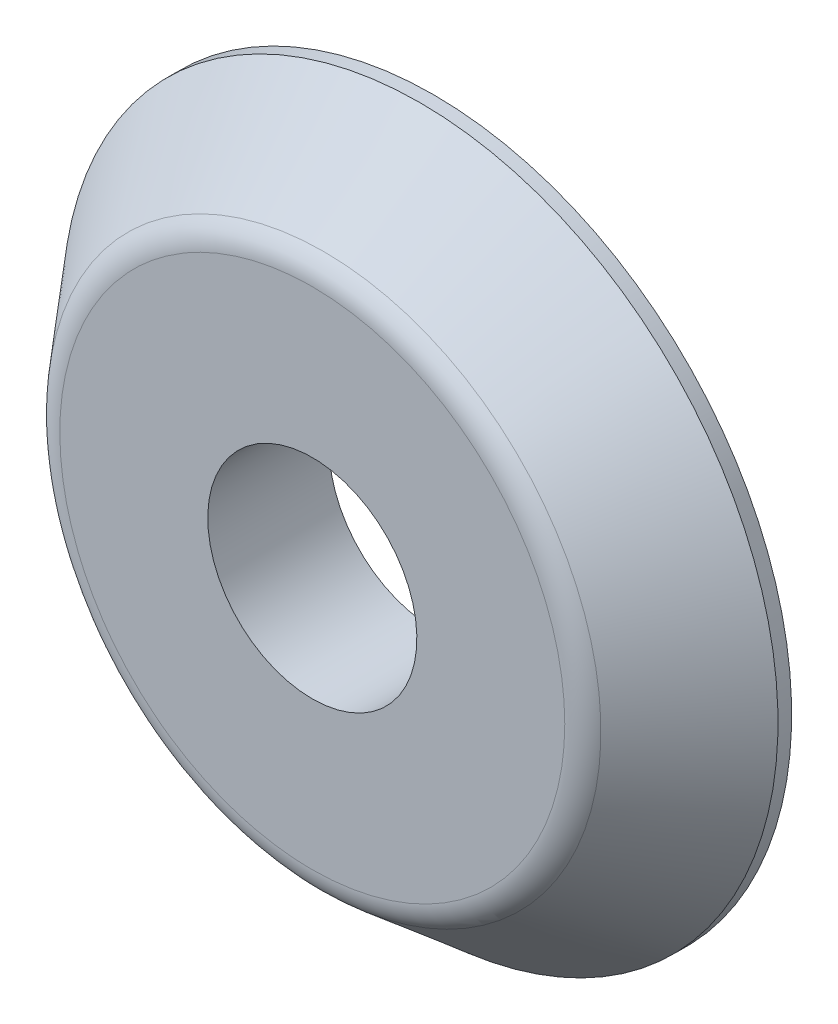
ISO-10303-21;
HEADER;
FILE_DESCRIPTION(('STEP AP214'),'2;1');
FILE_NAME('part.step','',(''),(''),'','','');
FILE_SCHEMA(('AUTOMOTIVE_DESIGN { 1 0 10303 214 1 1 1 1 }'));
ENDSEC;
DATA;
#1=APPLICATION_CONTEXT('core data for automotive mechanical design processes');
#2=APPLICATION_PROTOCOL_DEFINITION('international standard','automotive_design',2000,#1);
#3=PRODUCT_CONTEXT('',#1,'mechanical');
#4=PRODUCT('Part','Part','',(#3));
#5=PRODUCT_RELATED_PRODUCT_CATEGORY('part','',(#4));
#6=PRODUCT_DEFINITION_FORMATION('','',#4);
#7=PRODUCT_DEFINITION_CONTEXT('part definition',#1,'design');
#8=PRODUCT_DEFINITION('design','',#6,#7);
#9=PRODUCT_DEFINITION_SHAPE('','',#8);
#10=(LENGTH_UNIT() NAMED_UNIT(*) SI_UNIT(.MILLI.,.METRE.));
#11=(NAMED_UNIT(*) PLANE_ANGLE_UNIT() SI_UNIT($,.RADIAN.));
#12=(NAMED_UNIT(*) SI_UNIT($,.STERADIAN.) SOLID_ANGLE_UNIT());
#13=UNCERTAINTY_MEASURE_WITH_UNIT(LENGTH_MEASURE(1.E-05),#10,'distance_accuracy_value','');
#14=(GEOMETRIC_REPRESENTATION_CONTEXT(3) GLOBAL_UNCERTAINTY_ASSIGNED_CONTEXT((#13)) GLOBAL_UNIT_ASSIGNED_CONTEXT((#10,
#11,#12)) REPRESENTATION_CONTEXT('',''));
#15=CARTESIAN_POINT('',(0.,0.,0.));
#16=DIRECTION('',(0.,0.,1.));
#17=DIRECTION('',(1.,0.,0.));
#18=AXIS2_PLACEMENT_3D('',#15,#16,#17);
#19=CARTESIAN_POINT('',(0.,0.,5.05));
#20=DIRECTION('',(0.,0.,-1.));
#21=DIRECTION('',(0.,-1.,0.));
#22=AXIS2_PLACEMENT_3D('',#19,#20,#21);
#23=PLANE('',#22);
#24=CARTESIAN_POINT('',(0.,0.,5.05));
#25=DIRECTION('',(0.,0.,-1.));
#26=DIRECTION('',(0.,1.,0.));
#27=AXIS2_PLACEMENT_3D('',#24,#25,#26);
#28=CIRCLE('',#27,6.5);
#29=CARTESIAN_POINT('',(0.,-6.5,5.05));
#30=VERTEX_POINT('',#29);
#31=EDGE_CURVE('E20',#30,#30,#28,.T.);
#32=ORIENTED_EDGE('',*,*,#31,.F.);
#33=EDGE_LOOP('',(#32));
#34=FACE_BOUND('',#33,.T.);
#35=CARTESIAN_POINT('',(0.,0.,5.05));
#36=DIRECTION('',(0.,0.,-1.));
#37=DIRECTION('',(0.,1.,0.));
#38=AXIS2_PLACEMENT_3D('',#35,#36,#37);
#39=CIRCLE('',#38,22.25);
#40=CARTESIAN_POINT('',(0.,-22.25,5.05));
#41=VERTEX_POINT('',#40);
#42=EDGE_CURVE('E55',#41,#41,#39,.T.);
#43=ORIENTED_EDGE('',*,*,#42,.T.);
#44=EDGE_LOOP('',(#43));
#45=FACE_BOUND('',#44,.T.);
#46=ADVANCED_FACE('F16',(#34,#45),#23,.T.);
#47=CARTESIAN_POINT('',(0.,0.,12.6));
#48=DIRECTION('',(0.,0.,-1.));
#49=DIRECTION('',(0.,-1.,0.));
#50=AXIS2_PLACEMENT_3D('',#47,#48,#49);
#51=PLANE('',#50);
#52=CARTESIAN_POINT('',(0.,0.,12.6));
#53=DIRECTION('',(0.,0.,1.));
#54=DIRECTION('',(0.,1.,0.));
#55=AXIS2_PLACEMENT_3D('',#52,#53,#54);
#56=CIRCLE('',#55,6.5);
#57=CARTESIAN_POINT('',(0.,-6.5,12.6));
#58=VERTEX_POINT('',#57);
#59=EDGE_CURVE('E69',#58,#58,#56,.T.);
#60=ORIENTED_EDGE('',*,*,#59,.F.);
#61=EDGE_LOOP('',(#60));
#62=FACE_BOUND('',#61,.T.);
#63=CARTESIAN_POINT('',(-8.08537E-12,0.,12.5999999999988));
#64=DIRECTION('',(0.,0.,-1.));
#65=DIRECTION('',(0.,1.,0.));
#66=AXIS2_PLACEMENT_3D('',#63,#64,#65);
#67=CIRCLE('',#66,15.6954149941855);
#68=CARTESIAN_POINT('',(-7.019857E-11,15.6954160210287,12.5999999999994));
#69=VERTEX_POINT('',#68);
#70=CARTESIAN_POINT('',(0.,-15.6954160176872,12.5999999999994));
#71=VERTEX_POINT('',#70);
#72=EDGE_CURVE('E84',#69,#71,#67,.T.);
#73=ORIENTED_EDGE('',*,*,#72,.F.);
#74=CARTESIAN_POINT('',(-0.111689208169563,-15.6950188423018,12.5999999999998));
#75=CARTESIAN_POINT('',(-0.483005853286635,-15.6923498950746,12.5999999999876));
#76=CARTESIAN_POINT('',(-0.854225076227949,-15.6766033391737,12.6000000076044));
#77=CARTESIAN_POINT('',(-1.22443458905494,-15.6478167741456,12.5999999865164));
#78=CARTESIAN_POINT('',(-1.40953934546844,-15.6334234916315,12.5999999759724));
#79=CARTESIAN_POINT('',(-1.59439170993881,-15.6157711947463,12.5999999567427));
#80=CARTESIAN_POINT('',(-1.77887804433875,-15.5948706559859,12.5999999152411));
#81=CARTESIAN_POINT('',(-1.80193883613875,-15.5922580886408,12.5999999100534));
#82=CARTESIAN_POINT('',(-1.82499390871889,-15.5895947675165,12.5999999045115));
#83=CARTESIAN_POINT('',(-1.84804304133534,-15.5868807257537,12.59999989858));
#84=CARTESIAN_POINT('',(-1.85956760764358,-15.5855237048724,12.5999998956142));
#85=CARTESIAN_POINT('',(-1.87109068896088,-15.5841540038314,12.599999892551));
#86=CARTESIAN_POINT('',(-1.8826122575428,-15.5827716252049,12.5999998893863));
#87=CARTESIAN_POINT('',(-1.89413382612471,-15.5813892465784,12.5999998862216));
#88=CARTESIAN_POINT('',(-1.89683288509374,-15.5810597340157,12.5999998854623));
#89=CARTESIAN_POINT('',(-1.90222079747864,-15.5804060454169,12.5999998840682));
#90=CARTESIAN_POINT('',(-1.92377244701825,-15.5777912910217,12.599999878492));
#91=CARTESIAN_POINT('',(-1.94728402993826,-15.5748901135069,12.5999998734397));
#92=CARTESIAN_POINT('',(-1.97275197260812,-15.5716758528082,12.5999998690476));
#93=CARTESIAN_POINT('',(-2.22743139930668,-15.5395332458215,12.599999825126));
#94=CARTESIAN_POINT('',(-2.67895540448583,-15.4796328914782,12.5999998805841));
#95=CARTESIAN_POINT('',(-3.31686259486846,-15.3414056201281,12.5999999489575));
#96=CARTESIAN_POINT('',(-3.38065331390672,-15.3275828929931,12.5999999557948));
#97=CARTESIAN_POINT('',(-3.44629278061976,-15.3129421162688,12.5999999624281));
#98=CARTESIAN_POINT('',(-3.51375882398726,-15.2974099802649,12.5999999685523));
#99=CARTESIAN_POINT('',(-3.54749184567102,-15.2896439122629,12.5999999716144));
#100=CARTESIAN_POINT('',(-3.58168151151839,-15.2816550044411,12.5999999745371));
#101=CARTESIAN_POINT('',(-3.61632470347103,-15.2734336409985,12.5999999772963));
#102=CARTESIAN_POINT('',(-3.6249855014592,-15.2713783001379,12.5999999779861));
#103=CARTESIAN_POINT('',(-3.63548556583398,-15.2688743483148,12.5999999788028));
#104=CARTESIAN_POINT('',(-3.63968083304484,-15.2678719581615,12.5999999791244));
#105=CARTESIAN_POINT('',(-3.64387610025568,-15.2668695680081,12.5999999794459));
#106=CARTESIAN_POINT('',(-3.64808257890269,-15.2658626867166,12.5999999797624));
#107=CARTESIAN_POINT('',(-3.65230025963155,-15.2648512841578,12.5999999800743));
#108=CARTESIAN_POINT('',(-3.66073562108929,-15.2628284790401,12.5999999806979));
#109=CARTESIAN_POINT('',(-3.66921579087442,-15.2607875888529,12.5999999813028));
#110=CARTESIAN_POINT('',(-3.67774071326988,-15.2587284027596,12.5999999818868));
#111=CARTESIAN_POINT('',(-3.74594009243356,-15.2422549140133,12.5999999865588));
#112=CARTESIAN_POINT('',(-3.81700363865771,-15.2246104872756,12.5999999900174));
#113=CARTESIAN_POINT('',(-3.89089347889032,-15.2056722248801,12.5999999926014));
#114=CARTESIAN_POINT('',(-4.70368172144907,-14.9973513385292,12.6000000210253));
#115=CARTESIAN_POINT('',(-5.87075558185291,-14.6413160113508,12.6000000034853));
#116=CARTESIAN_POINT('',(-7.27051696939428,-13.9099494131095,12.5999999997513));
#117=CARTESIAN_POINT('',(-7.33414248700982,-13.8767054768258,12.5999999995816));
#118=CARTESIAN_POINT('',(-7.3982180910851,-13.8426712813272,12.599999999316));
#119=CARTESIAN_POINT('',(-7.46272271385329,-13.8078219919215,12.5999999989246));
#120=CARTESIAN_POINT('',(-7.52722733662146,-13.7729727025158,12.5999999985332));
#121=CARTESIAN_POINT('',(-7.58102381277695,-13.743403469948,12.5999999981038));
#122=CARTESIAN_POINT('',(-7.6375726940379,-13.7119171418785,12.5999999976109));
#123=CARTESIAN_POINT('',(-8.82509920051799,-13.0507042524181,12.5999999872604));
#124=CARTESIAN_POINT('',(-9.92454673993712,-12.2351368621353,12.5999999731915));
#125=CARTESIAN_POINT('',(-10.8999626056873,-11.2935361277406,12.5999999874852));
#126=CARTESIAN_POINT('',(-10.9231867929671,-11.271117062636,12.5999999878255));
#127=CARTESIAN_POINT('',(-10.9493062628256,-11.2457511101213,12.5999999882103));
#128=CARTESIAN_POINT('',(-10.9749638058054,-11.2206508011033,12.5999999885592));
#129=CARTESIAN_POINT('',(-11.0006213487853,-11.1955504920853,12.5999999889081));
#130=CARTESIAN_POINT('',(-11.0261928759906,-11.170362273816,12.5999999892348));
#131=CARTESIAN_POINT('',(-11.0516777870457,-11.1450867359911,12.5999999895413));
#132=CARTESIAN_POINT('',(-11.1536174312662,-11.0439845846912,12.5999999907672));
#133=CARTESIAN_POINT('',(-11.254171217084,-10.9414853205002,12.5999999916634));
#134=CARTESIAN_POINT('',(-11.3533010317675,-10.8376270808695,12.5999999923661));
#135=CARTESIAN_POINT('',(-11.5515606611346,-10.6299106016082,12.5999999937716));
#136=CARTESIAN_POINT('',(-11.7441244059646,-10.4167582205885,12.599999994306));
#137=CARTESIAN_POINT('',(-11.9307031478971,-10.1984897236835,12.5999999942744));
#138=CARTESIAN_POINT('',(-12.303860631762,-9.76195272987342,12.5999999942111));
#139=CARTESIAN_POINT('',(-12.6530591953649,-9.30493714352092,12.5999999924768));
#140=CARTESIAN_POINT('',(-12.9762050734289,-8.83018255067066,12.599999984157));
#141=CARTESIAN_POINT('',(-13.0569915429449,-8.71149390245809,12.5999999820771));
#142=CARTESIAN_POINT('',(-13.1351314684443,-8.59334987353269,12.5999999786102));
#143=CARTESIAN_POINT('',(-13.2152237526257,-8.468385942757,12.5999999767178));
#144=CARTESIAN_POINT('',(-13.2953160368071,-8.34342201198131,12.5999999748254));
#145=CARTESIAN_POINT('',(-13.3736185851533,-8.2173111362085,12.5999999761942));
#146=CARTESIAN_POINT('',(-13.4500990112091,-8.0901055343716,12.5999999801235));
#147=CARTESIAN_POINT('',(-13.5265794372648,-7.9628999325347,12.5999999840527));
#148=CARTESIAN_POINT('',(-13.6012377410301,-7.83459960463373,12.5999999905419));
#149=CARTESIAN_POINT('',(-13.6740430857257,-7.70525769428129,12.5999999952416));
#150=CARTESIAN_POINT('',(-13.7104457580734,-7.64058673910507,12.5999999975914));
#151=CARTESIAN_POINT('',(-13.7463851906537,-7.57565538831598,12.5999999994382));
#152=CARTESIAN_POINT('',(-13.7818577099802,-7.51047038785718,12.5999999998936));
#153=CARTESIAN_POINT('',(-13.7840747424381,-7.5063963253285,12.599999999922));
#154=CARTESIAN_POINT('',(-13.7862899510161,-7.50232127198081,12.599999999945));
#155=CARTESIAN_POINT('',(-13.7885033348249,-7.4982452294628,12.5999999999622));
#156=CARTESIAN_POINT('',(-13.7901633726815,-7.49518819757429,12.5999999999751));
#157=CARTESIAN_POINT('',(-13.7909340012303,-7.4937673684664,12.5999999999789));
#158=CARTESIAN_POINT('',(-13.7914090264673,-7.49289181854911,12.5999999999814));
#159=CARTESIAN_POINT('',(-13.7928341021784,-7.49026516879727,12.5999999999889));
#160=CARTESIAN_POINT('',(-13.7935902229701,-7.48887113795576,12.5999999999905));
#161=CARTESIAN_POINT('',(-13.7948147905125,-7.48661258834109,12.5999999999932));
#162=CARTESIAN_POINT('',(-13.7969917994768,-7.48259738902612,12.599999999998));
#163=CARTESIAN_POINT('',(-13.7995126985948,-7.47794494394421,12.5999999999996));
#164=CARTESIAN_POINT('',(-13.8023757238919,-7.47265429611396,12.6));
#165=CARTESIAN_POINT('',(-13.8081017744862,-7.46207300045346,12.6000000000006));
#166=CARTESIAN_POINT('',(-13.815196329797,-7.44893889379959,12.5999999999976));
#167=CARTESIAN_POINT('',(-13.8236376213008,-7.43324028946556,12.5999999999974));
#168=CARTESIAN_POINT('',(-13.8911679533308,-7.30765145479327,12.5999999999956));
#169=CARTESIAN_POINT('',(-14.0478980640393,-7.01914305783064,12.600000004259));
#170=CARTESIAN_POINT('',(-14.2623484857273,-6.55273476464006,12.5999999882771));
#171=CARTESIAN_POINT('',(-14.2891547884383,-6.49443372799126,12.5999999862794));
#172=CARTESIAN_POINT('',(-14.3168147408753,-6.43333680242315,12.5999999839014));
#173=CARTESIAN_POINT('',(-14.3452245817744,-6.36940308297265,12.5999999810424));
#174=CARTESIAN_POINT('',(-14.3487758118868,-6.36141136804133,12.599999980685));
#175=CARTESIAN_POINT('',(-14.3523387590064,-6.3533753282056,12.5999999803184));
#176=CARTESIAN_POINT('',(-14.3559131857838,-6.3452948791752,12.5999999799455));
#177=CARTESIAN_POINT('',(-14.3594876125612,-6.33721443014481,12.5999999795726));
#178=CARTESIAN_POINT('',(-14.3600826012485,-6.33586235599193,12.5999999795091));
#179=CARTESIAN_POINT('',(-14.3617616935187,-6.33205701698489,12.5999999793341));
#180=CARTESIAN_POINT('',(-14.3651198780592,-6.32444633897082,12.5999999789843));
#181=CARTESIAN_POINT('',(-14.3684812383819,-6.31681194745188,12.5999999786368));
#182=CARTESIAN_POINT('',(-14.3718456681412,-6.30915380829683,12.5999999782924));
#183=CARTESIAN_POINT('',(-14.3785745276596,-6.29383752998675,12.5999999776036));
#184=CARTESIAN_POINT('',(-14.3853156649241,-6.27842626113221,12.5999999769273));
#185=CARTESIAN_POINT('',(-14.3920682298679,-6.26291973044091,12.5999999762676));
#186=CARTESIAN_POINT('',(-14.4190784896434,-6.20089360767569,12.5999999736286));
#187=CARTESIAN_POINT('',(-14.4462715922895,-6.13734329552229,12.5999999712963));
#188=CARTESIAN_POINT('',(-14.4735925174854,-6.0722512730519,12.5999999693231));
#189=CARTESIAN_POINT('',(-14.5282343678773,-5.94206722811111,12.5999999653768));
#190=CARTESIAN_POINT('',(-14.5833875084688,-5.80571634190243,12.5999999633456));
#191=CARTESIAN_POINT('',(-14.6385701835281,-5.66306788187404,12.5999999637393));
#192=CARTESIAN_POINT('',(-14.7489355336466,-5.37777096181726,12.5999999645267));
#193=CARTESIAN_POINT('',(-14.859465747358,-5.06726172828179,12.5999999763275));
#194=CARTESIAN_POINT('',(-14.9657490630268,-4.73069376235952,12.5999999876081));
#195=CARTESIAN_POINT('',(-14.9790344774854,-4.68862276661926,12.5999999890182));
#196=CARTESIAN_POINT('',(-14.9922525783558,-4.64614505605119,12.5999999903929));
#197=CARTESIAN_POINT('',(-15.0053939279228,-4.60325940023615,12.5999999916865));
#198=CARTESIAN_POINT('',(-15.0119646027063,-4.58181657232861,12.5999999923333));
#199=CARTESIAN_POINT('',(-15.018516089664,-4.56027175810933,12.5999999929595));
#200=CARTESIAN_POINT('',(-15.0250471877499,-4.53862481698881,12.5999999935592));
#201=CARTESIAN_POINT('',(-15.0266799622714,-4.53321308170868,12.5999999937091));
#202=CARTESIAN_POINT('',(-15.0288485658491,-4.52600624923117,12.5999999939057));
#203=CARTESIAN_POINT('',(-15.0291333761249,-4.52505918268488,12.5999999939309));
#204=CARTESIAN_POINT('',(-15.0294181864008,-4.52411211613859,12.5999999939562));
#205=CARTESIAN_POINT('',(-15.0297104995673,-4.52313982676117,12.5999999939808));
#206=CARTESIAN_POINT('',(-15.0300102922317,-4.52214230770691,12.5999999940057));
#207=CARTESIAN_POINT('',(-15.0354065601922,-4.5041869647302,12.5999999944529));
#208=CARTESIAN_POINT('',(-15.0432360471937,-4.47805999324314,12.5999999947004));
#209=CARTESIAN_POINT('',(-15.0533703589301,-4.44372350901006,12.599999994821));
#210=CARTESIAN_POINT('',(-15.1254365757218,-4.19955295446365,12.5999999956783));
#211=CARTESIAN_POINT('',(-15.331589811894,-3.54158341724674,12.5999999966888));
#212=CARTESIAN_POINT('',(-15.5052789243221,-2.43827921892934,12.5999999586903));
#213=CARTESIAN_POINT('',(-15.5107067090855,-2.40380096273193,12.5999999575028));
#214=CARTESIAN_POINT('',(-15.5160850142234,-2.36888865519425,12.5999999562701));
#215=CARTESIAN_POINT('',(-15.5214052868941,-2.33354179284316,12.5999999549897));
#216=CARTESIAN_POINT('',(-15.5240654232294,-2.31586836166759,12.5999999543494));
#217=CARTESIAN_POINT('',(-15.5267110514479,-2.29808629178867,12.5999999536967));
#218=CARTESIAN_POINT('',(-15.5293410774766,-2.28019553028659,12.599999953032));
#219=CARTESIAN_POINT('',(-15.5319711035053,-2.26230476878454,12.5999999523674));
#220=CARTESIAN_POINT('',(-15.5329664534717,-2.25541894127506,12.5999999521105));
#221=CARTESIAN_POINT('',(-15.5344168316433,-2.24539622098623,12.5999999517494));
#222=CARTESIAN_POINT('',(-15.5402183443296,-2.20530533983086,12.5999999503051));
#223=CARTESIAN_POINT('',(-15.5458639140401,-2.16519187542564,12.5999999489936));
#224=CARTESIAN_POINT('',(-15.5513533885939,-2.1250570490614,12.59999994783));
#225=CARTESIAN_POINT('',(-15.5623323377016,-2.04478739633293,12.5999999455027));
#226=CARTESIAN_POINT('',(-15.5726869061828,-1.96443229576838,12.5999999437686));
#227=CARTESIAN_POINT('',(-15.5824155582032,-1.88400149377324,12.5999999427911));
#228=CARTESIAN_POINT('',(-15.621330166285,-1.56227828579266,12.599999938881));
#229=CARTESIAN_POINT('',(-15.6502301109948,-1.23934385492265,12.599999947969));
#230=CARTESIAN_POINT('',(-15.669059243782,-0.915826224936262,12.5999999632499));
#231=CARTESIAN_POINT('',(-15.6784738101756,-0.754067409943066,12.5999999708903));
#232=CARTESIAN_POINT('',(-15.6853712898837,-0.592162853866396,12.5999999797531));
#233=CARTESIAN_POINT('',(-15.6897484122847,-0.430191309601257,12.5999999870295));
#234=CARTESIAN_POINT('',(-15.6919369734852,-0.349205537468687,12.5999999906677));
#235=CARTESIAN_POINT('',(-15.6934954453589,-0.268203018289001,12.5999999938927));
#236=CARTESIAN_POINT('',(-15.6944236975321,-0.187193605235958,12.5999999962258));
#237=CARTESIAN_POINT('',(-15.6948878236187,-0.14668889870943,12.5999999973923));
#238=CARTESIAN_POINT('',(-15.6951943947802,-0.106182468714559,12.599999998335));
#239=CARTESIAN_POINT('',(-15.6953434024693,-0.0656755466990596,12.5999999989871));
#240=CARTESIAN_POINT('',(-15.6954179063139,-0.0454220856913256,12.5999999993131));
#241=CARTESIAN_POINT('',(-15.6954530192904,-0.0251685016784316,12.5999999995665));
#242=CARTESIAN_POINT('',(-15.6954487412744,-0.00491494860416157,12.5999999997383));
#243=CARTESIAN_POINT('',(-15.6954466022664,0.00521182793296743,12.5999999998242));
#244=CARTESIAN_POINT('',(-15.6954346155103,0.0153385967354434,12.5999999998897));
#245=CARTESIAN_POINT('',(-15.6954127810497,0.0254653385600704,12.5999999999337));
#246=CARTESIAN_POINT('',(-15.6954018638193,0.0305287094723964,12.5999999999557));
#247=CARTESIAN_POINT('',(-15.6953884846628,0.0355920736402584,12.5999999999723));
#248=CARTESIAN_POINT('',(-15.6953726435893,0.0406554286582514,12.5999999999834));
#249=CARTESIAN_POINT('',(-15.6953647230525,0.0431871061672514,12.599999999989));
#250=CARTESIAN_POINT('',(-15.6953561870365,0.0457187813887804,12.5999999999931));
#251=CARTESIAN_POINT('',(-15.6953470355426,0.0482504540221814,12.5999999999959));
#252=CARTESIAN_POINT('',(-15.6953424597956,0.0495162903388804,12.5999999999973));
#253=CARTESIAN_POINT('',(-15.6953377301792,0.0507821260085514,12.5999999999983));
#254=CARTESIAN_POINT('',(-15.6953328466935,0.0520479609935954,12.599999999999));
#255=CARTESIAN_POINT('',(-15.6953279632077,0.0533137959786384,12.5999999999997));
#256=CARTESIAN_POINT('',(-15.6953182047688,0.0557308243821614,12.6));
#257=CARTESIAN_POINT('',(-15.6953177346286,0.0558454638572844,12.6));
#258=CARTESIAN_POINT('',(-15.6951823342615,0.0888616326920404,12.5999999999994));
#259=CARTESIAN_POINT('',(-15.7040935448204,0.449655839675516,12.6000000107704));
#260=CARTESIAN_POINT('',(-15.6546457144397,1.13485960294132,12.599999976035));
#261=CARTESIAN_POINT('',(-15.6539589390177,1.14437632187557,12.5999999755526));
#262=CARTESIAN_POINT('',(-15.6532589486111,1.15395532980557,12.5999999750592));
#263=CARTESIAN_POINT('',(-15.6525453979277,1.16359658539688,12.5999999745546));
#264=CARTESIAN_POINT('',(-15.6518318472442,1.17323784098818,12.5999999740501));
#265=CARTESIAN_POINT('',(-15.6516004345154,1.17630729184766,12.5999999738869));
#266=CARTESIAN_POINT('',(-15.6511908128239,1.18175573337475,12.5999999736006));
#267=CARTESIAN_POINT('',(-15.650371569441,1.19265261642892,12.5999999730279));
#268=CARTESIAN_POINT('',(-15.6495426075555,1.20352573780688,12.599999972457));
#269=CARTESIAN_POINT('',(-15.6487040709576,1.21437508543422,12.5999999718891));
#270=CARTESIAN_POINT('',(-15.647026997762,1.23607378068894,12.5999999707532));
#271=CARTESIAN_POINT('',(-15.6453116257171,1.2576773809412,12.5999999696295));
#272=CARTESIAN_POINT('',(-15.6435591056214,1.27918578659063,12.5999999685264));
#273=CARTESIAN_POINT('',(-15.6365490252389,1.36521940918839,12.5999999641139));
#274=CARTESIAN_POINT('',(-15.6289445760444,1.4497299181409,12.5999999600849));
#275=CARTESIAN_POINT('',(-15.6208188871364,1.53271176154289,12.5999999566722));
#276=CARTESIAN_POINT('',(-15.6045675093205,1.69867544834687,12.5999999498469));
#277=CARTESIAN_POINT('',(-15.5862311726506,1.85852447294872,12.5999999461335));
#278=CARTESIAN_POINT('',(-15.5663579131442,2.01224265443367,12.599999946663));
#279=CARTESIAN_POINT('',(-15.556421283391,2.08910174517614,12.5999999469278));
#280=CARTESIAN_POINT('',(-15.5460997870845,2.16442859014094,12.5999999482097));
#281=CARTESIAN_POINT('',(-15.535458035209,2.23822373072443,12.5999999504012));
#282=CARTESIAN_POINT('',(-15.5248162833336,2.31201887130792,12.5999999525928));
#283=CARTESIAN_POINT('',(-15.5122596370203,2.39492227158138,12.5999999555121));
#284=CARTESIAN_POINT('',(-15.4995528064817,2.47443973784898,12.5999999579806));
#285=CARTESIAN_POINT('',(-15.4741391454045,2.63347467038417,12.5999999629176));
#286=CARTESIAN_POINT('',(-15.4462779677593,2.79211814061852,12.5999999673526));
#287=CARTESIAN_POINT('',(-15.4159816044114,2.95029479424611,12.599999971448));
#288=CARTESIAN_POINT('',(-15.3553888777157,3.26664810150128,12.599999979639));
#289=CARTESIAN_POINT('',(-15.2850554082092,3.58113414232941,12.5999999860374));
#290=CARTESIAN_POINT('',(-15.2051143374283,3.89315723526506,12.5999999906965));
#291=CARTESIAN_POINT('',(-15.1651438020379,4.04916878173287,12.5999999930261));
#292=CARTESIAN_POINT('',(-15.1227719402337,4.20456471614743,12.5999999949193));
#293=CARTESIAN_POINT('',(-15.0780188466229,4.35927142995468,12.5999999963748));
#294=CARTESIAN_POINT('',(-15.033265753012,4.51397814376196,12.5999999978303));
#295=CARTESIAN_POINT('',(-14.9879663173921,4.66200721275847,12.5999999982826));
#296=CARTESIAN_POINT('',(-14.9398340953754,4.81151445666879,12.599999997411));
#297=CARTESIAN_POINT('',(-14.8917018733587,4.96102170057911,12.5999999965394));
#298=CARTESIAN_POINT('',(-14.8413479634644,5.10981359094284,12.599999994663));
#299=CARTESIAN_POINT('',(-14.7887943798116,5.25782511729324,12.5999999874099));
#300=CARTESIAN_POINT('',(-14.7625175879852,5.33183088046844,12.5999999837834));
#301=CARTESIAN_POINT('',(-14.7356908777191,5.40564155264031,12.5999999787373));
#302=CARTESIAN_POINT('',(-14.708317212755,5.47924908115888,12.5999999712457));
#303=CARTESIAN_POINT('',(-14.6946303802729,5.51605284541818,12.5999999674999));
#304=CARTESIAN_POINT('',(-14.6808068091163,5.55280582376415,12.5999999631379));
#305=CARTESIAN_POINT('',(-14.6668468760853,5.5895070121733,12.5999999580021));
#306=CARTESIAN_POINT('',(-14.6659743802708,5.59180083644888,12.5999999576811));
#307=CARTESIAN_POINT('',(-14.665579516235,5.59283854010228,12.5999999574841));
#308=CARTESIAN_POINT('',(-14.6653401220339,5.59346729486868,12.5999999574036));
#309=CARTESIAN_POINT('',(-14.6651007278329,5.59409604963509,12.5999999573231));
#310=CARTESIAN_POINT('',(-14.6650168034666,5.59431585551451,12.5999999573381));
#311=CARTESIAN_POINT('',(-14.6647661869914,5.5949738842421,12.5999999572535));
#312=CARTESIAN_POINT('',(-14.6642649540409,5.59628994169727,12.5999999570843));
#313=CARTESIAN_POINT('',(-14.6637483014499,5.59764582074599,12.5999999569193));
#314=CARTESIAN_POINT('',(-14.6632161960625,5.59904150867043,12.5999999567585));
#315=CARTESIAN_POINT('',(-14.6621519852878,5.60183288451933,12.5999999564369));
#316=CARTESIAN_POINT('',(-14.6610259633278,5.60478349587114,12.5999999561326));
#317=CARTESIAN_POINT('',(-14.6598378512847,5.60789323569944,12.5999999558439));
#318=CARTESIAN_POINT('',(-14.6574616271983,5.61411271535603,12.5999999552667));
#319=CARTESIAN_POINT('',(-14.6548370427792,5.62096870891858,12.5999999547592));
#320=CARTESIAN_POINT('',(-14.6519614197669,5.62846018145897,12.5999999543243));
#321=CARTESIAN_POINT('',(-14.60595145157,5.74832374210514,12.5999999473664));
#322=CARTESIAN_POINT('',(-14.4982799384132,6.03218808185456,12.5999999651211));
#323=CARTESIAN_POINT('',(-14.3010886738584,6.46783867330934,12.5999999839463));
#324=CARTESIAN_POINT('',(-14.2764397657891,6.52229499724119,12.5999999862995));
#325=CARTESIAN_POINT('',(-14.2503529234354,6.57910038147171,12.5999999885751));
#326=CARTESIAN_POINT('',(-14.2227410117031,6.63820977830546,12.5999999906483));
#327=CARTESIAN_POINT('',(-14.2158380337701,6.65298712751391,12.5999999911666));
#328=CARTESIAN_POINT('',(-14.2088397390008,6.66790847751006,12.5999999916683));
#329=CARTESIAN_POINT('',(-14.2017446539219,6.68297302796863,12.5999999921569));
#330=CARTESIAN_POINT('',(-14.1981971113824,6.69050530319791,12.5999999924013));
#331=CARTESIAN_POINT('',(-14.1946253712655,6.6980733785428,12.5999999926422));
#332=CARTESIAN_POINT('',(-14.1910292562458,6.70567715958978,12.5999999928792));
#333=CARTESIAN_POINT('',(-14.1874331412261,6.71328094063672,12.5999999931161));
#334=CARTESIAN_POINT('',(-14.1832372867641,6.72212900564022,12.5999999933844));
#335=CARTESIAN_POINT('',(-14.1817479733619,6.72526685883893,12.5999999934779));
#336=CARTESIAN_POINT('',(-14.1757907197529,6.73781827163382,12.5999999938518));
#337=CARTESIAN_POINT('',(-14.1697462601635,6.75051085680662,12.5999999941983));
#338=CARTESIAN_POINT('',(-14.1636134693693,6.76334404334233,12.5999999945154));
#339=CARTESIAN_POINT('',(-14.1390823061925,6.81467678948513,12.5999999957842));
#340=CARTESIAN_POINT('',(-14.1131378437395,6.86825915743455,12.599999996638));
#341=CARTESIAN_POINT('',(-14.0857006808385,6.92404847917926,12.5999999972516));
#342=CARTESIAN_POINT('',(-13.9210777034327,7.25878440964753,12.600000000933));
#343=CARTESIAN_POINT('',(-13.7032840475276,7.67366317079676,12.6000000029954));
#344=CARTESIAN_POINT('',(-13.410857326553,8.15481125890127,12.5999999911048));
#345=CARTESIAN_POINT('',(-13.3864884331385,8.19490693290998,12.599999990114));
#346=CARTESIAN_POINT('',(-13.3615975351975,8.23545750354308,12.5999999889764));
#347=CARTESIAN_POINT('',(-13.3361703120918,8.27645189094548,12.5999999876577));
#348=CARTESIAN_POINT('',(-13.3298135063154,8.28670048779608,12.5999999873281));
#349=CARTESIAN_POINT('',(-13.32386060602,8.29627015795983,12.5999999870076));
#350=CARTESIAN_POINT('',(-13.3190193945355,8.30403934590671,12.5999999867476));
#351=CARTESIAN_POINT('',(-13.314178183051,8.31180853385356,12.5999999864876));
#352=CARTESIAN_POINT('',(-13.3093301523629,8.31957347477545,12.5999999862266));
#353=CARTESIAN_POINT('',(-13.3044753099996,8.32733415669836,12.599999985965));
#354=CARTESIAN_POINT('',(-13.2947656252728,8.34285552054421,12.5999999854417));
#355=CARTESIAN_POINT('',(-13.2850286938451,8.35835984839414,12.5999999849158));
#356=CARTESIAN_POINT('',(-13.275264575903,8.37384704444964,12.5999999843891));
#357=CARTESIAN_POINT('',(-13.2362081041347,8.4357958286716,12.5999999822824));
#358=CARTESIAN_POINT('',(-13.1967166481373,8.49747050418276,12.5999999801644));
#359=CARTESIAN_POINT('',(-13.1567940814926,8.55886495092851,12.5999999781511));
#360=CARTESIAN_POINT('',(-13.0769489482031,8.68165384442,12.5999999741244));
#361=CARTESIAN_POINT('',(-12.995379372324,8.80332182284985,12.5999999705254));
#362=CARTESIAN_POINT('',(-12.9121175928396,8.92382074955113,12.5999999679602));
#363=CARTESIAN_POINT('',(-12.5790704749018,9.40581645635626,12.5999999576995));
#364=CARTESIAN_POINT('',(-12.2189221082039,9.86908743135862,12.5999999714985));
#365=CARTESIAN_POINT('',(-11.8339480701561,10.3107076430807,12.5999999879234));
#366=CARTESIAN_POINT('',(-11.7377045606442,10.4211126960112,12.5999999920296));
#367=CARTESIAN_POINT('',(-11.6399110521187,10.5301658446612,12.5999999958301));
#368=CARTESIAN_POINT('',(-11.5406062511138,10.6378239823012,12.5999999980504));
#369=CARTESIAN_POINT('',(-11.5281931509882,10.6512812495062,12.599999998328));
#370=CARTESIAN_POINT('',(-11.5157564369176,10.6647167196642,12.5999999985805));
#371=CARTESIAN_POINT('',(-11.5032961887501,10.6781303124304,12.5999999988048));
#372=CARTESIAN_POINT('',(-11.5001811267082,10.6814837106219,12.5999999988608));
#373=CARTESIAN_POINT('',(-11.4977177160541,10.6841325158313,12.5999999989034));
#374=CARTESIAN_POINT('',(-11.4968700692325,10.6850439223429,12.5999999989178));
#375=CARTESIAN_POINT('',(-11.4960224224108,10.6859553288546,12.5999999989322));
#376=CARTESIAN_POINT('',(-11.4951652300919,10.6868767908677,12.5999999989464));
#377=CARTESIAN_POINT('',(-11.4942984846552,10.6878083012266,12.5999999989604));
#378=CARTESIAN_POINT('',(-11.4925649937818,10.6896713219442,12.5999999989884));
#379=CARTESIAN_POINT('',(-11.4907932904371,10.6915745360447,12.5999999990158));
#380=CARTESIAN_POINT('',(-11.4889833139787,10.6935178864207,12.5999999990425));
#381=CARTESIAN_POINT('',(-11.4817434081449,10.7012912879244,12.5999999991492));
#382=CARTESIAN_POINT('',(-11.4738911324914,10.709706869835,12.5999999992471));
#383=CARTESIAN_POINT('',(-11.4654224419875,10.7187608401577,12.5999999993292));
#384=CARTESIAN_POINT('',(-11.4484850609798,10.736868780803,12.5999999994935));
#385=CARTESIAN_POINT('',(-11.4290820205707,10.7575302750967,12.5999999996201));
#386=CARTESIAN_POINT('',(-11.4071716599042,10.7807055914332,12.5999999997157));
#387=CARTESIAN_POINT('',(-11.1661576925729,11.0356340711352,12.6000000007673));
#388=CARTESIAN_POINT('',(-10.6309487273444,11.6099575549038,12.5999999998045));
#389=CARTESIAN_POINT('',(-9.67863531913405,12.3559627895349,12.5999999999738));
#390=CARTESIAN_POINT('',(-9.63534834603359,12.3898721183818,12.5999999999815));
#391=CARTESIAN_POINT('',(-9.59118472775365,12.4241012930317,12.599999999988));
#392=CARTESIAN_POINT('',(-9.54612956881963,12.4586258817913,12.5999999999926));
#393=CARTESIAN_POINT('',(-9.5236019893526,12.4758881761711,12.5999999999949));
#394=CARTESIAN_POINT('',(-9.50085152472206,12.4932243240783,12.5999999999967));
#395=CARTESIAN_POINT('',(-9.47787630851181,12.5106311517609,12.599999999998));
#396=CARTESIAN_POINT('',(-9.4663887004067,12.5193345656022,12.5999999999987));
#397=CARTESIAN_POINT('',(-9.45484490440665,12.5280556493873,12.5999999999991));
#398=CARTESIAN_POINT('',(-9.44324468734739,12.5367940029497,12.5999999999995));
#399=CARTESIAN_POINT('',(-9.43744457881776,12.5411631797309,12.5999999999996));
#400=CARTESIAN_POINT('',(-9.43163036502332,12.5455366739563,12.5999999999998));
#401=CARTESIAN_POINT('',(-9.42580201681402,12.5499144351951,12.6));
#402=CARTESIAN_POINT('',(-9.42288784270934,12.5521033158145,12.6));
#403=CARTESIAN_POINT('',(-9.41997013500095,12.5542932631872,12.6));
#404=CARTESIAN_POINT('',(-9.41704889004512,12.5564842709823,12.6));
#405=CARTESIAN_POINT('',(-9.41412764508932,12.5586752787773,12.6));
#406=CARTESIAN_POINT('',(-9.4097432059838,12.5619605344624,12.6));
#407=CARTESIAN_POINT('',(-9.40827453979179,12.5630604692955,12.6));
#408=CARTESIAN_POINT('',(-8.28033890433012,13.4078104211262,12.6000000000011));
#409=CARTESIAN_POINT('',(-7.03802526181247,14.0996439585014,12.5999999993178));
#410=CARTESIAN_POINT('',(-5.72593724577175,14.6137207753814,12.5999999997081));
#411=CARTESIAN_POINT('',(-5.50725590976497,14.6994002448614,12.5999999997732));
#412=CARTESIAN_POINT('',(-5.28665083445649,14.7801694399934,12.599999999844));
#413=CARTESIAN_POINT('',(-5.06434440153613,14.8559470524628,12.5999999999001));
#414=CARTESIAN_POINT('',(-4.95319118507594,14.8938358586975,12.5999999999282));
#415=CARTESIAN_POINT('',(-4.84161262921277,14.9304767692665,12.5999999999539));
#416=CARTESIAN_POINT('',(-4.72963692895781,14.9658607495945,12.5999999999717));
#417=CARTESIAN_POINT('',(-4.67364907883033,14.9835527397584,12.5999999999807));
#418=CARTESIAN_POINT('',(-4.6175619426049,15.0009304973621,12.5999999999878));
#419=CARTESIAN_POINT('',(-4.56137905308779,15.0179929253483,12.5999999999926));
#420=CARTESIAN_POINT('',(-4.53328760832925,15.0265241393414,12.599999999995));
#421=CARTESIAN_POINT('',(-4.50517222524778,15.0349765209301,12.5999999999969));
#422=CARTESIAN_POINT('',(-4.4770333466865,15.0433499368422,12.5999999999982));
#423=CARTESIAN_POINT('',(-4.46296390740586,15.0475366447983,12.5999999999988));
#424=CARTESIAN_POINT('',(-4.44888859425526,15.0517036113352,12.5999999999993));
#425=CARTESIAN_POINT('',(-4.43480746266431,15.0558508200362,12.5999999999996));
#426=CARTESIAN_POINT('',(-4.42776689686883,15.0579244243866,12.5999999999997));
#427=CARTESIAN_POINT('',(-4.42072487646326,15.0599930892781,12.5999999999998));
#428=CARTESIAN_POINT('',(-4.41368140838105,15.0620568126744,12.6));
#429=CARTESIAN_POINT('',(-4.40663794029886,15.0641205360706,12.6));
#430=CARTESIAN_POINT('',(-4.39811089695506,15.0666113214474,12.6));
#431=CARTESIAN_POINT('',(-4.39254666803943,15.068233156346,12.6));
#432=CARTESIAN_POINT('',(-4.03643601743889,15.1720305898562,12.5999999999994));
#433=CARTESIAN_POINT('',(-3.67666635097482,15.2632669647331,12.6000000037216));
#434=CARTESIAN_POINT('',(-3.31412649357783,15.3417169078504,12.5999999920653));
#435=CARTESIAN_POINT('',(-3.13285656487935,15.380941879409,12.5999999862371));
#436=CARTESIAN_POINT('',(-2.95089434058408,15.4169712100446,12.5999999758485));
#437=CARTESIAN_POINT('',(-2.76835226148053,15.4497826068714,12.5999999541923));
#438=CARTESIAN_POINT('',(-2.67708122192876,15.4661883052848,12.5999999433642));
#439=CARTESIAN_POINT('',(-2.58566521867492,15.481789520246,12.5999999296892));
#440=CARTESIAN_POINT('',(-2.49411839020042,15.4965839070586,12.5999999120447));
#441=CARTESIAN_POINT('',(-2.44834497596317,15.5039811004649,12.5999999032225));
#442=CARTESIAN_POINT('',(-2.40253885542076,15.5111765868341,12.5999998934057));
#443=CARTESIAN_POINT('',(-2.35670179741371,15.5181700855023,12.5999998824393));
#444=CARTESIAN_POINT('',(-2.33378326841017,15.5216668348364,12.5999998769561));
#445=CARTESIAN_POINT('',(-2.31085700504048,15.5251130872453,12.5999998711854));
#446=CARTESIAN_POINT('',(-2.28792322866101,15.528508809149,12.5999998651068));
#447=CARTESIAN_POINT('',(-2.27645634047129,15.5302066701009,12.5999998620675));
#448=CARTESIAN_POINT('',(-2.26498757402912,15.5318918984265,12.5999998589512));
#449=CARTESIAN_POINT('',(-2.25351695701875,15.5335644900225,12.5999998557553));
#450=CARTESIAN_POINT('',(-2.24778164851358,15.5344007858204,12.5999998541574));
#451=CARTESIAN_POINT('',(-2.24204587736635,15.535233922436,12.5999998525395));
#452=CARTESIAN_POINT('',(-2.23630964703847,15.5360638993621,12.5999998509014));
#453=CARTESIAN_POINT('',(-2.23344153187453,15.5364788878252,12.5999998500824));
#454=CARTESIAN_POINT('',(-2.23057330191543,15.5368930863659,12.5999998492583));
#455=CARTESIAN_POINT('',(-2.22770495759392,15.5373064949213,12.5999998484291));
#456=CARTESIAN_POINT('',(-2.2248366132724,15.5377199034766,12.5999998475999));
#457=CARTESIAN_POINT('',(-2.22002543123632,15.5384114304077,12.5999998461971));
#458=CARTESIAN_POINT('',(-2.21909958197487,15.5385443505684,12.5999998459262));
#459=CARTESIAN_POINT('',(-2.11540446469294,15.5534314085656,12.5999998155816));
#460=CARTESIAN_POINT('',(-1.8219435678544,15.5977354559024,12.5999998640182));
#461=CARTESIAN_POINT('',(-1.33553544423435,15.6390259820487,12.5999999295088));
#462=CARTESIAN_POINT('',(-1.30079200683293,15.6419753053449,12.5999999341867));
#463=CARTESIAN_POINT('',(-1.26506419798933,15.6448913407449,12.5999999388518));
#464=CARTESIAN_POINT('',(-1.22835124330599,15.6477539725846,12.5999999434376));
#465=CARTESIAN_POINT('',(-1.2099947659643,15.6491852885044,12.5999999457305));
#466=CARTESIAN_POINT('',(-1.19139200216268,15.6506032535342,12.5999999479994));
#467=CARTESIAN_POINT('',(-1.17254287734742,15.652005228474,12.5999999502405));
#468=CARTESIAN_POINT('',(-1.1631183149398,15.6527062159439,12.599999951361));
#469=CARTESIAN_POINT('',(-1.15363216227877,15.6534032058913,12.5999999524743));
#470=CARTESIAN_POINT('',(-1.14408441094907,15.654095864626,12.5999999535791));
#471=CARTESIAN_POINT('',(-1.13453665961935,15.6547885233608,12.599999954684));
#472=CARTESIAN_POINT('',(-1.12366182710812,15.6555663111517,12.5999999559224));
#473=CARTESIAN_POINT('',(-1.115256352982,15.656160511371,12.5999999568667));
#474=CARTESIAN_POINT('',(-0.577306008911119,15.6941893254074,12.600000017301));
#475=CARTESIAN_POINT('',(-0.204833104299788,15.6954030439377,12.5999999999993));
#476=CARTESIAN_POINT('',(-1.404023E-10,15.6954170478719,12.6));
#477=(BOUNDED_CURVE() B_SPLINE_CURVE(3,(#74,#75,#76,#77,#78,#79,#80,#81,#82,#83,#84,#85,#86,#87,
#88,#89,#90,#91,#92,#93,#94,#95,#96,#97,#98,#99,#100,#101,#102,#103,#104,#105,#106,#107,#108,
#109,#110,#111,#112,#113,#114,#115,#116,#117,#118,#119,#120,#121,#122,#123,#124,#125,#126,#127,
#128,#129,#130,#131,#132,#133,#134,#135,#136,#137,#138,#139,#140,#141,#142,#143,#144,#145,#146,
#147,#148,#149,#150,#151,#152,#153,#154,#155,#156,#157,#158,#159,#160,#161,#162,#163,#164,#165,
#166,#167,#168,#169,#170,#171,#172,#173,#174,#175,#176,#177,#178,#179,#180,#181,#182,#183,#184,
#185,#186,#187,#188,#189,#190,#191,#192,#193,#194,#195,#196,#197,#198,#199,#200,#201,#202,#203,
#204,#205,#206,#207,#208,#209,#210,#211,#212,#213,#214,#215,#216,#217,#218,#219,#220,#221,#222,
#223,#224,#225,#226,#227,#228,#229,#230,#231,#232,#233,#234,#235,#236,#237,#238,#239,#240,#241,
#242,#243,#244,#245,#246,#247,#248,#249,#250,#251,#252,#253,#254,#255,#256,#257,#258,#259,#260,
#261,#262,#263,#264,#265,#266,#267,#268,#269,#270,#271,#272,#273,#274,#275,#276,#277,#278,#279,
#280,#281,#282,#283,#284,#285,#286,#287,#288,#289,#290,#291,#292,#293,#294,#295,#296,#297,#298,
#299,#300,#301,#302,#303,#304,#305,#306,#307,#308,#309,#310,#311,#312,#313,#314,#315,#316,#317,
#318,#319,#320,#321,#322,#323,#324,#325,#326,#327,#328,#329,#330,#331,#332,#333,#334,#335,#336,
#337,#338,#339,#340,#341,#342,#343,#344,#345,#346,#347,#348,#349,#350,#351,#352,#353,#354,#355,
#356,#357,#358,#359,#360,#361,#362,#363,#364,#365,#366,#367,#368,#369,#370,#371,#372,#373,#374,
#375,#376,#377,#378,#379,#380,#381,#382,#383,#384,#385,#386,#387,#388,#389,#390,#391,#392,#393,
#394,#395,#396,#397,#398,#399,#400,#401,#402,#403,#404,#405,#406,#407,#408,#409,#410,#411,#412,
#413,#414,#415,#416,#417,#418,#419,#420,#421,#422,#423,#424,#425,#426,#427,#428,#429,#430,#431,
#432,#433,#434,#435,#436,#437,#438,#439,#440,#441,#442,#443,#444,#445,#446,#447,#448,#449,#450,
#451,#452,#453,#454,#455,#456,#457,#458,#459,#460,#461,#462,#463,#464,#465,#466,#467,#468,#469,
#470,#471,#472,#473,#474,#475,#476),.UNSPECIFIED.,.F.,.F.) B_SPLINE_CURVE_WITH_KNOTS((4,3,3,3,3,
3,3,3,3,3,3,3,3,3,3,3,3,3,3,3,3,3,3,3,3,3,3,3,3,3,3,3,3,3,3,3,3,3,3,3,3,3,3,3,3,3,3,3,3,3,3,3,3,
3,3,3,3,3,3,3,3,3,3,3,3,3,3,3,3,3,3,3,3,3,3,3,3,3,3,3,3,3,3,3,3,3,3,3,3,3,3,3,3,3,3,3,3,3,3,3,3,
3,3,3,3,3,3,3,3,3,3,3,3,3,3,3,3,3,3,3,3,3,3,3,3,3,3,3,3,3,3,3,3,3,4),(0.,0.031249999999992,
0.046874999999989,0.048828124999988,0.049804687499988,0.050781249999988,0.054687499999987,
0.093749999999978,0.097656249999977,0.099609374999977,0.100097656249977,0.100585937499976,
0.101562499999976,0.109374999999975,0.195312499999963,0.199218749999963,0.203124999999962,
0.285156249999951,0.287109374999951,0.289062499999951,0.29687499999995,0.312499999999948,
0.343749999999944,0.351562499999943,0.359374999999942,0.367187499999941,0.371093749999941,
0.371337890624941,0.371520996093691,0.37207031249994,0.37304687499994,0.374999999999939,
0.390624999999933,0.392578124999932,0.392822265624932,0.393066406249932,0.393554687499932,
0.394531249999931,0.398437499999929,0.406249999999925,0.421874999999917,0.423828124999915,
0.424804687499915,0.425048828124915,0.425292968749915,0.429687499999911,0.460937499999887,
0.461914062499886,0.462402343749886,0.462890624999885,0.464843749999884,0.468749999999881,
0.484374999999869,0.492187499999863,0.49609374999986,0.498046874999859,0.499023437499858,
0.499511718749857,0.499755859374857,0.499877929687357,0.499938964843607,0.5,0.517578124999844,
0.517822265624844,0.518066406249844,0.518554687499843,0.519531249999842,0.523437499999839,
0.531249999999833,0.53515624999983,0.539062499999827,0.546874999999821,0.562499999999809,
0.570312499999802,0.578124999999796,0.58593749999979,0.589843749999787,0.591796874999786,
0.591918945312286,0.592041015624786,0.592285156249785,0.592773437499785,0.593749999999785,
0.609374999999775,0.611328124999774,0.611816406249774,0.612060546874774,0.612304687499773,
0.613281249999773,0.61718749999977,0.640624999999756,0.642578124999755,0.643066406249755,
0.643554687499754,0.644531249999754,0.648437499999752,0.656249999999748,0.687499999999733,
0.695312499999729,0.696289062499729,0.696533203124729,0.696777343749729,0.697265624999729,
0.69921874999973,0.703124999999733,0.746093749999768,0.748046874999769,0.74902343749977,
0.74951171874977,0.74975585937477,0.749877929687271,0.749999999999771,0.843749999999858,
0.859374999999872,0.86718749999988,0.871093749999884,0.873046874999885,0.874023437499886,
0.874511718749887,0.874999999999887,0.90624999999992,0.921874999999936,0.929687499999944,
0.933593749999948,0.935546874999951,0.936523437499952,0.937011718749952,0.937255859374952,
0.937499999999953,0.964843749999974,0.966796874999975,0.967773437499976,0.968261718749976,
0.968749999999977,1.),
.UNSPECIFIED.) CURVE() GEOMETRIC_REPRESENTATION_ITEM() RATIONAL_B_SPLINE_CURVE((1.,1.,1.,1.,1.,
1.,1.,1.,1.,1.,1.,1.,1.,1.,1.,1.,1.,1.,1.,1.,1.,1.,1.,1.,1.,1.,1.,1.,1.,1.,1.,1.,1.,1.,1.,1.,1.,
1.,1.,1.,1.,1.,1.,1.,1.,1.,1.,1.,1.,1.,1.,1.,1.,1.,1.,1.,1.,1.,1.,1.,1.,1.,1.,1.,1.,1.,1.,1.,1.,
1.,1.,1.,1.,1.,1.,1.,1.,1.,1.,1.,1.,1.,1.,1.,1.,1.,1.,1.,1.,1.,1.,1.,1.,1.,1.,1.,1.,1.,1.,1.,1.,
1.,1.,1.,1.,1.,1.,1.,1.,1.,1.,1.,1.,1.,1.,1.,1.,1.,1.,1.,1.,1.,1.,1.,1.,1.,1.,1.,1.,1.,1.,1.,1.,
1.,1.,1.,1.,1.,1.,1.,1.,1.,1.,1.,1.,1.,1.,1.,1.,1.,1.,1.,1.,1.,1.,1.,1.,1.,1.,1.,1.,1.,1.,1.,1.,
1.,1.,1.,1.,1.,1.,1.,1.,1.,1.,1.,1.,1.,1.,1.,1.,1.,1.,1.,1.,1.,1.,1.,1.,1.,1.,1.,1.,1.,1.,1.,1.,
1.,1.,1.,1.,1.,1.,1.,1.,1.,1.,1.,1.,1.,1.,1.,1.,1.,1.,1.,1.,1.,1.,1.,1.,1.,1.,1.,1.,1.,1.,1.,1.,
1.,1.,1.,1.,1.,1.,1.,1.,1.,1.,1.,1.,1.,1.,1.,1.,1.,1.,1.,1.,1.,1.,1.,1.,1.,1.,1.,1.,1.,1.,1.,1.,
1.,1.,1.,1.,1.,1.,1.,1.,1.,1.,1.,1.,1.,1.,1.,1.,1.,1.,1.,1.,1.,1.,1.,1.,1.,1.,1.,1.,1.,1.,1.,1.,
1.,1.,1.,1.,1.,1.,1.,1.,1.,1.,1.,1.,1.,1.,1.,1.,1.,1.,1.,1.,1.,1.,1.,1.,1.,1.,1.,1.,1.,1.,1.,1.,
1.,1.,1.,1.,1.,1.,1.,1.,1.,1.,1.,1.,1.,1.,1.,1.,1.,1.,1.,1.,1.,1.,1.,1.,1.,1.,1.,1.,1.,1.,1.,1.,
1.,1.,1.,1.,1.,1.,1.,1.,1.,1.,1.,1.,1.,1.,1.,1.,1.,1.,1.,1.,1.,1.,1.,1.,1.,1.,1.,1.,1.,1.,1.,1.,
1.,1.,1.,1.,1.,1.,1.,1.,1.,1.,1.,1.,1.,1.)) REPRESENTATION_ITEM(''));
#478=CARTESIAN_POINT('',(-0.111689208169564,-15.6950188423018,12.6));
#479=VERTEX_POINT('',#478);
#480=EDGE_CURVE('E11',#479,#69,#477,.T.);
#481=ORIENTED_EDGE('',*,*,#480,.F.);
#482=CARTESIAN_POINT('',(-17.3421587943848,24.438341343093,12.6000000670268));
#483=DIRECTION('',(5.96344110335065E-12,1.67266294340873E-09,-1.));
#484=DIRECTION('',(-0.529636171460524,0.848224926467407,1.41563594806292E-09));
#485=AXIS2_PLACEMENT_3D('',#482,#483,#484);
#486=ELLIPSE('',#485,45.2251641658259,22.2717380338044);
#487=EDGE_CURVE('E27',#71,#479,#486,.T.);
#488=ORIENTED_EDGE('',*,*,#487,.F.);
#489=EDGE_LOOP('',(#73,#481,#488));
#490=FACE_BOUND('',#489,.T.);
#491=ADVANCED_FACE('F104',(#62,#490),#51,.F.);
#492=CARTESIAN_POINT('',(-8.08537E-12,0.,10.6));
#493=DIRECTION('',(0.,0.,-1.));
#494=DIRECTION('',(0.,1.,0.));
#495=AXIS2_PLACEMENT_3D('',#492,#493,#494);
#496=TOROIDAL_SURFACE('',#495,15.6954171548,2.);
#497=ORIENTED_EDGE('',*,*,#72,.T.);
#498=ORIENTED_EDGE('',*,*,#487,.T.);
#499=ORIENTED_EDGE('',*,*,#480,.T.);
#500=EDGE_LOOP('',(#497,#498,#499));
#501=FACE_BOUND('',#500,.T.);
#502=CARTESIAN_POINT('',(0.,0.,11.8855753030589));
#503=DIRECTION('',(0.,0.,-1.));
#504=DIRECTION('',(1.,0.,0.));
#505=AXIS2_PLACEMENT_3D('',#502,#503,#504);
#506=CIRCLE('',#505,17.2275059708238);
#507=CARTESIAN_POINT('',(-8.08326030867276E-12,-17.2275059708238,11.8855753030589));
#508=VERTEX_POINT('',#507);
#509=EDGE_CURVE('E79',#508,#508,#506,.T.);
#510=ORIENTED_EDGE('',*,*,#509,.F.);
#511=EDGE_LOOP('',(#510));
#512=FACE_BOUND('',#511,.T.);
#513=ADVANCED_FACE('F103',(#501,#512),#496,.T.);
#514=CARTESIAN_POINT('',(0.,0.,5.90000000000146));
#515=DIRECTION('',(0.,0.,-1.));
#516=DIRECTION('',(0.,1.,0.));
#517=AXIS2_PLACEMENT_3D('',#514,#515,#516);
#518=CONICAL_SURFACE('',#517,22.2500000000017,0.698131699999868);
#519=ORIENTED_EDGE('',*,*,#509,.T.);
#520=EDGE_LOOP('',(#519));
#521=FACE_BOUND('',#520,.T.);
#522=CARTESIAN_POINT('',(0.,0.,5.90000000000146));
#523=DIRECTION('',(0.,0.,-1.));
#524=DIRECTION('',(0.,1.,0.));
#525=AXIS2_PLACEMENT_3D('',#522,#523,#524);
#526=CIRCLE('',#525,22.25);
#527=CARTESIAN_POINT('',(0.,-22.25,5.90000000000146));
#528=VERTEX_POINT('',#527);
#529=EDGE_CURVE('E85',#528,#528,#526,.T.);
#530=ORIENTED_EDGE('',*,*,#529,.F.);
#531=EDGE_LOOP('',(#530));
#532=FACE_BOUND('',#531,.T.);
#533=ADVANCED_FACE('F80',(#521,#532),#518,.T.);
#534=CARTESIAN_POINT('',(0.,0.,12.95));
#535=DIRECTION('',(0.,0.,1.));
#536=DIRECTION('',(0.,1.,0.));
#537=AXIS2_PLACEMENT_3D('',#534,#535,#536);
#538=CYLINDRICAL_SURFACE('',#537,22.25);
#539=ORIENTED_EDGE('',*,*,#529,.T.);
#540=EDGE_LOOP('',(#539));
#541=FACE_BOUND('',#540,.T.);
#542=ORIENTED_EDGE('',*,*,#42,.F.);
#543=EDGE_LOOP('',(#542));
#544=FACE_BOUND('',#543,.T.);
#545=ADVANCED_FACE('F116',(#541,#544),#538,.T.);
#546=CARTESIAN_POINT('',(0.,0.,12.6));
#547=DIRECTION('',(0.,0.,1.));
#548=DIRECTION('',(0.,1.,0.));
#549=AXIS2_PLACEMENT_3D('',#546,#547,#548);
#550=CYLINDRICAL_SURFACE('',#549,6.5);
#551=ORIENTED_EDGE('',*,*,#31,.T.);
#552=EDGE_LOOP('',(#551));
#553=FACE_BOUND('',#552,.T.);
#554=ORIENTED_EDGE('',*,*,#59,.T.);
#555=EDGE_LOOP('',(#554));
#556=FACE_BOUND('',#555,.T.);
#557=ADVANCED_FACE('F18',(#553,#556),#550,.F.);
#558=CLOSED_SHELL('',(#46,#491,#513,#533,#545,#557));
#559=MANIFOLD_SOLID_BREP('B1',#558);
#560=ADVANCED_BREP_SHAPE_REPRESENTATION('',(#18,#559),#14);
#561=SHAPE_DEFINITION_REPRESENTATION(#9,#560);
ENDSEC;
END-ISO-10303-21;
